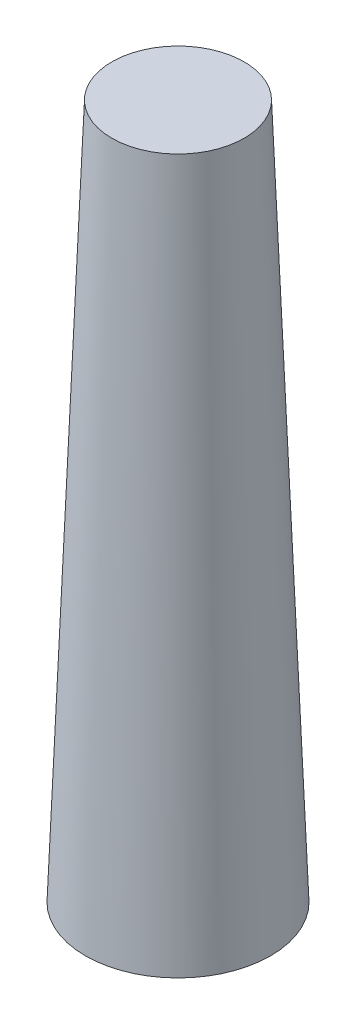
ISO-10303-21;
HEADER;
FILE_DESCRIPTION(('STEP AP214'),'2;1');
FILE_NAME('part.step','',(''),(''),'','','');
FILE_SCHEMA(('AUTOMOTIVE_DESIGN { 1 0 10303 214 1 1 1 1 }'));
ENDSEC;
DATA;
#1=APPLICATION_CONTEXT('core data for automotive mechanical design processes');
#2=APPLICATION_PROTOCOL_DEFINITION('international standard','automotive_design',2000,#1);
#3=PRODUCT_CONTEXT('',#1,'mechanical');
#4=PRODUCT('Part','Part','',(#3));
#5=PRODUCT_RELATED_PRODUCT_CATEGORY('part','',(#4));
#6=PRODUCT_DEFINITION_FORMATION('','',#4);
#7=PRODUCT_DEFINITION_CONTEXT('part definition',#1,'design');
#8=PRODUCT_DEFINITION('design','',#6,#7);
#9=PRODUCT_DEFINITION_SHAPE('','',#8);
#10=(LENGTH_UNIT() NAMED_UNIT(*) SI_UNIT(.MILLI.,.METRE.));
#11=(NAMED_UNIT(*) PLANE_ANGLE_UNIT() SI_UNIT($,.RADIAN.));
#12=(NAMED_UNIT(*) SI_UNIT($,.STERADIAN.) SOLID_ANGLE_UNIT());
#13=UNCERTAINTY_MEASURE_WITH_UNIT(LENGTH_MEASURE(1.E-05),#10,'distance_accuracy_value','');
#14=(GEOMETRIC_REPRESENTATION_CONTEXT(3) GLOBAL_UNCERTAINTY_ASSIGNED_CONTEXT((#13)) GLOBAL_UNIT_ASSIGNED_CONTEXT((#10,
#11,#12)) REPRESENTATION_CONTEXT('',''));
#15=CARTESIAN_POINT('',(0.,0.,0.));
#16=DIRECTION('',(0.,0.,1.));
#17=DIRECTION('',(1.,0.,0.));
#18=AXIS2_PLACEMENT_3D('',#15,#16,#17);
#19=CARTESIAN_POINT('',(0.,0.,0.));
#20=DIRECTION('',(0.,1.,0.));
#21=DIRECTION('',(0.,0.,1.));
#22=AXIS2_PLACEMENT_3D('',#19,#20,#21);
#23=PLANE('',#22);
#24=CARTESIAN_POINT('',(0.,0.,0.));
#25=DIRECTION('',(0.,1.,0.));
#26=DIRECTION('',(0.,0.,1.));
#27=AXIS2_PLACEMENT_3D('',#24,#25,#26);
#28=CIRCLE('',#27,5.08);
#29=CARTESIAN_POINT('',(0.,0.,5.08));
#30=VERTEX_POINT('',#29);
#31=EDGE_CURVE('E44',#30,#30,#28,.T.);
#32=ORIENTED_EDGE('',*,*,#31,.F.);
#33=EDGE_LOOP('',(#32));
#34=FACE_BOUND('',#33,.T.);
#35=ADVANCED_FACE('F36',(#34),#23,.F.);
#36=CARTESIAN_POINT('',(0.,38.1,0.));
#37=DIRECTION('',(0.,1.,0.));
#38=DIRECTION('',(0.,0.,1.));
#39=AXIS2_PLACEMENT_3D('',#36,#37,#38);
#40=PLANE('',#39);
#41=CARTESIAN_POINT('',(0.,38.1,0.));
#42=DIRECTION('',(0.,1.,0.));
#43=DIRECTION('',(0.,0.,1.));
#44=AXIS2_PLACEMENT_3D('',#41,#42,#43);
#45=CIRCLE('',#44,3.62857142857143);
#46=CARTESIAN_POINT('',(0.,38.1,3.62857142857143));
#47=VERTEX_POINT('',#46);
#48=EDGE_CURVE('E11',#47,#47,#45,.T.);
#49=ORIENTED_EDGE('',*,*,#48,.T.);
#50=EDGE_LOOP('',(#49));
#51=FACE_BOUND('',#50,.T.);
#52=ADVANCED_FACE('F84',(#51),#40,.T.);
#53=CARTESIAN_POINT('',(0.,38.1,0.));
#54=DIRECTION('',(0.,-1.,0.));
#55=DIRECTION('',(0.,0.,-1.));
#56=AXIS2_PLACEMENT_3D('',#53,#54,#55);
#57=CONICAL_SURFACE('',#56,3.62857142857143,0.0380768255898034);
#58=ORIENTED_EDGE('',*,*,#48,.F.);
#59=EDGE_LOOP('',(#58));
#60=FACE_BOUND('',#59,.T.);
#61=ORIENTED_EDGE('',*,*,#31,.T.);
#62=EDGE_LOOP('',(#61));
#63=FACE_BOUND('',#62,.T.);
#64=ADVANCED_FACE('F69',(#60,#63),#57,.T.);
#65=CLOSED_SHELL('',(#35,#52,#64));
#66=MANIFOLD_SOLID_BREP('B2',#65);
#67=ADVANCED_BREP_SHAPE_REPRESENTATION('',(#18,#66),#14);
#68=SHAPE_DEFINITION_REPRESENTATION(#9,#67);
ENDSEC;
END-ISO-10303-21;
